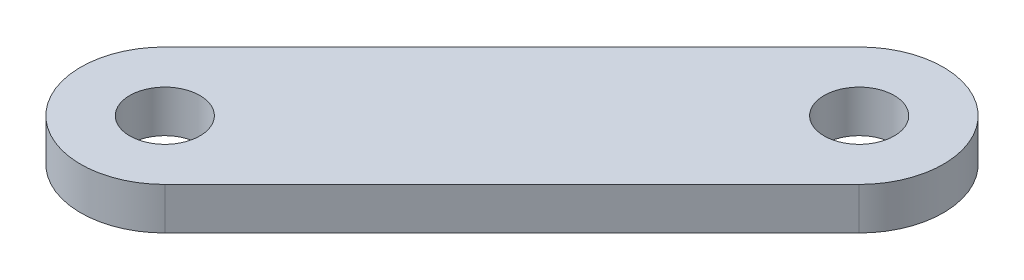
ISO-10303-21;
HEADER;
FILE_DESCRIPTION(('STEP AP214'),'2;1');
FILE_NAME('part.step','',(''),(''),'','','');
FILE_SCHEMA(('AUTOMOTIVE_DESIGN { 1 0 10303 214 1 1 1 1 }'));
ENDSEC;
DATA;
#1=APPLICATION_CONTEXT('core data for automotive mechanical design processes');
#2=APPLICATION_PROTOCOL_DEFINITION('international standard','automotive_design',2000,#1);
#3=PRODUCT_CONTEXT('',#1,'mechanical');
#4=PRODUCT('Part','Part','',(#3));
#5=PRODUCT_RELATED_PRODUCT_CATEGORY('part','',(#4));
#6=PRODUCT_DEFINITION_FORMATION('','',#4);
#7=PRODUCT_DEFINITION_CONTEXT('part definition',#1,'design');
#8=PRODUCT_DEFINITION('design','',#6,#7);
#9=PRODUCT_DEFINITION_SHAPE('','',#8);
#10=(LENGTH_UNIT() NAMED_UNIT(*) SI_UNIT(.MILLI.,.METRE.));
#11=(NAMED_UNIT(*) PLANE_ANGLE_UNIT() SI_UNIT($,.RADIAN.));
#12=(NAMED_UNIT(*) SI_UNIT($,.STERADIAN.) SOLID_ANGLE_UNIT());
#13=UNCERTAINTY_MEASURE_WITH_UNIT(LENGTH_MEASURE(1.E-05),#10,'distance_accuracy_value','');
#14=(GEOMETRIC_REPRESENTATION_CONTEXT(3) GLOBAL_UNCERTAINTY_ASSIGNED_CONTEXT((#13)) GLOBAL_UNIT_ASSIGNED_CONTEXT((#10,
#11,#12)) REPRESENTATION_CONTEXT('',''));
#15=CARTESIAN_POINT('',(0.,0.,0.));
#16=DIRECTION('',(0.,0.,1.));
#17=DIRECTION('',(1.,0.,0.));
#18=AXIS2_PLACEMENT_3D('',#15,#16,#17);
#19=CARTESIAN_POINT('',(32.1735620692423,42.,16.5809411083559));
#20=DIRECTION('',(0.,1.,0.));
#21=DIRECTION('',(0.,0.,1.));
#22=AXIS2_PLACEMENT_3D('',#19,#20,#21);
#23=PLANE('',#22);
#24=CARTESIAN_POINT('',(32.1735620692423,42.,16.5809411083559));
#25=DIRECTION('',(0.,1.,0.));
#26=DIRECTION('',(0.,0.,1.));
#27=AXIS2_PLACEMENT_3D('',#24,#25,#26);
#28=CIRCLE('',#27,2.50000000000002);
#29=CARTESIAN_POINT('',(32.1735620692423,42.,19.0809411083559));
#30=VERTEX_POINT('',#29);
#31=EDGE_CURVE('E102',#30,#30,#28,.T.);
#32=ORIENTED_EDGE('',*,*,#31,.F.);
#33=EDGE_LOOP('',(#32));
#34=FACE_BOUND('',#33,.T.);
#35=CARTESIAN_POINT('',(32.1735620692423,42.,16.5809411083559));
#36=DIRECTION('',(0.,1.,0.));
#37=DIRECTION('',(0.,0.,1.));
#38=AXIS2_PLACEMENT_3D('',#35,#36,#37);
#39=CIRCLE('',#38,6.);
#40=CARTESIAN_POINT('',(36.4162027563616,42.,20.8235817954752));
#41=VERTEX_POINT('',#40);
#42=CARTESIAN_POINT('',(27.930921382123,42.,12.3383004212366));
#43=VERTEX_POINT('',#42);
#44=EDGE_CURVE('E87',#41,#43,#39,.T.);
#45=ORIENTED_EDGE('',*,*,#44,.T.);
#46=DIRECTION('',(-0.707106781186548,0.,0.707106781186547));
#47=VECTOR('',#46,1.);
#48=CARTESIAN_POINT('',(27.930921382123,42.,12.3383004212366));
#49=LINE('',#48,#47);
#50=CARTESIAN_POINT('',(3.18218404059386,42.,37.0870377627658));
#51=VERTEX_POINT('',#50);
#52=EDGE_CURVE('E82',#43,#51,#49,.T.);
#53=ORIENTED_EDGE('',*,*,#52,.T.);
#54=CARTESIAN_POINT('',(7.42482472771316,42.,41.329678449885));
#55=DIRECTION('',(0.,1.,0.));
#56=DIRECTION('',(0.,0.,1.));
#57=AXIS2_PLACEMENT_3D('',#54,#55,#56);
#58=CIRCLE('',#57,6.00000000000001);
#59=CARTESIAN_POINT('',(11.6674654148324,42.,45.5723191370043));
#60=VERTEX_POINT('',#59);
#61=EDGE_CURVE('E85',#51,#60,#58,.T.);
#62=ORIENTED_EDGE('',*,*,#61,.T.);
#63=DIRECTION('',(0.707106781186547,0.,-0.707106781186548));
#64=VECTOR('',#63,1.);
#65=CARTESIAN_POINT('',(36.4162027563616,42.,20.8235817954752));
#66=LINE('',#65,#64);
#67=EDGE_CURVE('E52',#60,#41,#66,.T.);
#68=ORIENTED_EDGE('',*,*,#67,.T.);
#69=EDGE_LOOP('',(#45,#53,#62,#68));
#70=FACE_BOUND('',#69,.T.);
#71=CARTESIAN_POINT('',(7.42482472771316,42.,41.329678449885));
#72=DIRECTION('',(0.,1.,0.));
#73=DIRECTION('',(0.,0.,1.));
#74=AXIS2_PLACEMENT_3D('',#71,#72,#73);
#75=CIRCLE('',#74,2.50000000000001);
#76=CARTESIAN_POINT('',(7.42482472771316,42.,43.829678449885));
#77=VERTEX_POINT('',#76);
#78=EDGE_CURVE('E117',#77,#77,#75,.T.);
#79=ORIENTED_EDGE('',*,*,#78,.F.);
#80=EDGE_LOOP('',(#79));
#81=FACE_BOUND('',#80,.T.);
#82=ADVANCED_FACE('F35',(#34,#70,#81),#23,.T.);
#83=CARTESIAN_POINT('',(32.1735620692423,39.,16.5809411083559));
#84=DIRECTION('',(0.,1.,0.));
#85=DIRECTION('',(0.,0.,1.));
#86=AXIS2_PLACEMENT_3D('',#83,#84,#85);
#87=PLANE('',#86);
#88=CARTESIAN_POINT('',(32.1735620692423,39.,16.5809411083559));
#89=DIRECTION('',(0.,1.,0.));
#90=DIRECTION('',(0.,0.,1.));
#91=AXIS2_PLACEMENT_3D('',#88,#89,#90);
#92=CIRCLE('',#91,6.);
#93=CARTESIAN_POINT('',(36.4162027563616,39.,20.8235817954752));
#94=VERTEX_POINT('',#93);
#95=CARTESIAN_POINT('',(27.930921382123,39.,12.3383004212366));
#96=VERTEX_POINT('',#95);
#97=EDGE_CURVE('E99',#94,#96,#92,.T.);
#98=ORIENTED_EDGE('',*,*,#97,.F.);
#99=DIRECTION('',(0.707106781186547,0.,-0.707106781186548));
#100=VECTOR('',#99,1.);
#101=CARTESIAN_POINT('',(36.4162027563616,39.,20.8235817954752));
#102=LINE('',#101,#100);
#103=CARTESIAN_POINT('',(11.6674654148324,39.,45.5723191370043));
#104=VERTEX_POINT('',#103);
#105=EDGE_CURVE('E75',#104,#94,#102,.T.);
#106=ORIENTED_EDGE('',*,*,#105,.F.);
#107=CARTESIAN_POINT('',(7.42482472771316,39.,41.329678449885));
#108=DIRECTION('',(0.,1.,0.));
#109=DIRECTION('',(0.,0.,1.));
#110=AXIS2_PLACEMENT_3D('',#107,#108,#109);
#111=CIRCLE('',#110,6.00000000000001);
#112=CARTESIAN_POINT('',(3.18218404059386,39.,37.0870377627658));
#113=VERTEX_POINT('',#112);
#114=EDGE_CURVE('E69',#113,#104,#111,.T.);
#115=ORIENTED_EDGE('',*,*,#114,.F.);
#116=DIRECTION('',(-0.707106781186548,0.,0.707106781186547));
#117=VECTOR('',#116,1.);
#118=CARTESIAN_POINT('',(27.930921382123,39.,12.3383004212366));
#119=LINE('',#118,#117);
#120=EDGE_CURVE('E91',#96,#113,#119,.T.);
#121=ORIENTED_EDGE('',*,*,#120,.F.);
#122=EDGE_LOOP('',(#98,#106,#115,#121));
#123=FACE_BOUND('',#122,.T.);
#124=CARTESIAN_POINT('',(32.1735620692423,39.,16.5809411083559));
#125=DIRECTION('',(0.,1.,0.));
#126=DIRECTION('',(0.,0.,1.));
#127=AXIS2_PLACEMENT_3D('',#124,#125,#126);
#128=CIRCLE('',#127,2.50000000000002);
#129=CARTESIAN_POINT('',(32.1735620692423,39.,19.0809411083559));
#130=VERTEX_POINT('',#129);
#131=EDGE_CURVE('E114',#130,#130,#128,.T.);
#132=ORIENTED_EDGE('',*,*,#131,.T.);
#133=EDGE_LOOP('',(#132));
#134=FACE_BOUND('',#133,.T.);
#135=CARTESIAN_POINT('',(7.42482472771316,39.,41.329678449885));
#136=DIRECTION('',(0.,1.,0.));
#137=DIRECTION('',(0.,0.,1.));
#138=AXIS2_PLACEMENT_3D('',#135,#136,#137);
#139=CIRCLE('',#138,2.50000000000001);
#140=CARTESIAN_POINT('',(7.42482472771316,39.,43.829678449885));
#141=VERTEX_POINT('',#140);
#142=EDGE_CURVE('E120',#141,#141,#139,.T.);
#143=ORIENTED_EDGE('',*,*,#142,.T.);
#144=EDGE_LOOP('',(#143));
#145=FACE_BOUND('',#144,.T.);
#146=ADVANCED_FACE('F110',(#123,#134,#145),#87,.F.);
#147=CARTESIAN_POINT('',(32.1735620692423,42.,16.5809411083559));
#148=DIRECTION('',(0.,-1.,0.));
#149=DIRECTION('',(0.,0.,-1.));
#150=AXIS2_PLACEMENT_3D('',#147,#148,#149);
#151=CYLINDRICAL_SURFACE('',#150,6.);
#152=ORIENTED_EDGE('',*,*,#97,.T.);
#153=DIRECTION('',(0.,-1.,0.));
#154=VECTOR('',#153,1.);
#155=CARTESIAN_POINT('',(27.930921382123,42.,12.3383004212366));
#156=LINE('',#155,#154);
#157=EDGE_CURVE('E11',#43,#96,#156,.T.);
#158=ORIENTED_EDGE('',*,*,#157,.F.);
#159=ORIENTED_EDGE('',*,*,#44,.F.);
#160=DIRECTION('',(0.,-1.,0.));
#161=VECTOR('',#160,1.);
#162=CARTESIAN_POINT('',(36.4162027563616,42.,20.8235817954752));
#163=LINE('',#162,#161);
#164=EDGE_CURVE('E95',#41,#94,#163,.T.);
#165=ORIENTED_EDGE('',*,*,#164,.T.);
#166=EDGE_LOOP('',(#152,#158,#159,#165));
#167=FACE_BOUND('',#166,.T.);
#168=ADVANCED_FACE('F37',(#167),#151,.T.);
#169=CARTESIAN_POINT('',(27.930921382123,42.,12.3383004212366));
#170=DIRECTION('',(0.707106781186547,0.,0.707106781186548));
#171=DIRECTION('',(0.707106781186548,0.,-0.707106781186547));
#172=AXIS2_PLACEMENT_3D('',#169,#170,#171);
#173=PLANE('',#172);
#174=ORIENTED_EDGE('',*,*,#120,.T.);
#175=DIRECTION('',(0.,-1.,0.));
#176=VECTOR('',#175,1.);
#177=CARTESIAN_POINT('',(3.18218404059386,42.,37.0870377627658));
#178=LINE('',#177,#176);
#179=EDGE_CURVE('E44',#51,#113,#178,.T.);
#180=ORIENTED_EDGE('',*,*,#179,.F.);
#181=ORIENTED_EDGE('',*,*,#52,.F.);
#182=ORIENTED_EDGE('',*,*,#157,.T.);
#183=EDGE_LOOP('',(#174,#180,#181,#182));
#184=FACE_BOUND('',#183,.T.);
#185=ADVANCED_FACE('F90',(#184),#173,.F.);
#186=CARTESIAN_POINT('',(7.42482472771316,42.,41.329678449885));
#187=DIRECTION('',(0.,-1.,0.));
#188=DIRECTION('',(0.,0.,-1.));
#189=AXIS2_PLACEMENT_3D('',#186,#187,#188);
#190=CYLINDRICAL_SURFACE('',#189,6.00000000000001);
#191=ORIENTED_EDGE('',*,*,#114,.T.);
#192=DIRECTION('',(0.,-1.,0.));
#193=VECTOR('',#192,1.);
#194=CARTESIAN_POINT('',(11.6674654148324,42.,45.5723191370043));
#195=LINE('',#194,#193);
#196=EDGE_CURVE('E92',#60,#104,#195,.T.);
#197=ORIENTED_EDGE('',*,*,#196,.F.);
#198=ORIENTED_EDGE('',*,*,#61,.F.);
#199=ORIENTED_EDGE('',*,*,#179,.T.);
#200=EDGE_LOOP('',(#191,#197,#198,#199));
#201=FACE_BOUND('',#200,.T.);
#202=ADVANCED_FACE('F93',(#201),#190,.T.);
#203=CARTESIAN_POINT('',(36.4162027563616,42.,20.8235817954752));
#204=DIRECTION('',(-0.707106781186548,0.,-0.707106781186547));
#205=DIRECTION('',(-0.707106781186547,0.,0.707106781186548));
#206=AXIS2_PLACEMENT_3D('',#203,#204,#205);
#207=PLANE('',#206);
#208=ORIENTED_EDGE('',*,*,#105,.T.);
#209=ORIENTED_EDGE('',*,*,#164,.F.);
#210=ORIENTED_EDGE('',*,*,#67,.F.);
#211=ORIENTED_EDGE('',*,*,#196,.T.);
#212=EDGE_LOOP('',(#208,#209,#210,#211));
#213=FACE_BOUND('',#212,.T.);
#214=ADVANCED_FACE('F107',(#213),#207,.F.);
#215=CARTESIAN_POINT('',(32.1735620692423,42.,16.5809411083559));
#216=DIRECTION('',(0.,-1.,0.));
#217=DIRECTION('',(0.,0.,-1.));
#218=AXIS2_PLACEMENT_3D('',#215,#216,#217);
#219=CYLINDRICAL_SURFACE('',#218,2.50000000000002);
#220=ORIENTED_EDGE('',*,*,#31,.T.);
#221=EDGE_LOOP('',(#220));
#222=FACE_BOUND('',#221,.T.);
#223=ORIENTED_EDGE('',*,*,#131,.F.);
#224=EDGE_LOOP('',(#223));
#225=FACE_BOUND('',#224,.T.);
#226=ADVANCED_FACE('F137',(#222,#225),#219,.F.);
#227=CARTESIAN_POINT('',(7.42482472771316,42.,41.329678449885));
#228=DIRECTION('',(0.,-1.,0.));
#229=DIRECTION('',(0.,0.,-1.));
#230=AXIS2_PLACEMENT_3D('',#227,#228,#229);
#231=CYLINDRICAL_SURFACE('',#230,2.50000000000001);
#232=ORIENTED_EDGE('',*,*,#78,.T.);
#233=EDGE_LOOP('',(#232));
#234=FACE_BOUND('',#233,.T.);
#235=ORIENTED_EDGE('',*,*,#142,.F.);
#236=EDGE_LOOP('',(#235));
#237=FACE_BOUND('',#236,.T.);
#238=ADVANCED_FACE('F126',(#234,#237),#231,.F.);
#239=CLOSED_SHELL('',(#82,#146,#168,#185,#202,#214,#226,#238));
#240=MANIFOLD_SOLID_BREP('B2',#239);
#241=ADVANCED_BREP_SHAPE_REPRESENTATION('',(#18,#240),#14);
#242=SHAPE_DEFINITION_REPRESENTATION(#9,#241);
ENDSEC;
END-ISO-10303-21;
